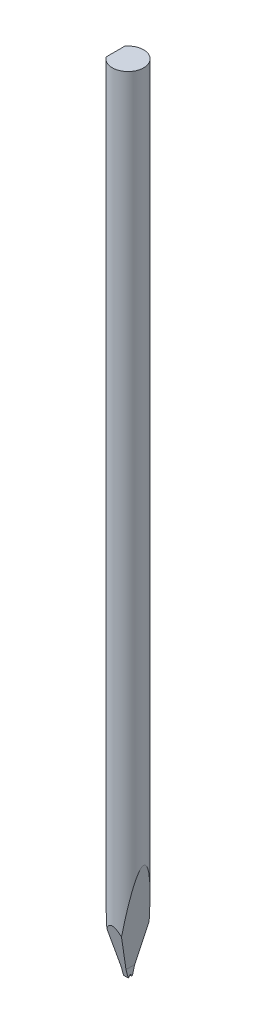
ISO-10303-21;
HEADER;
FILE_DESCRIPTION(('STEP AP214'),'2;1');
FILE_NAME('part.step','',(''),(''),'','','');
FILE_SCHEMA(('AUTOMOTIVE_DESIGN { 1 0 10303 214 1 1 1 1 }'));
ENDSEC;
DATA;
#1=APPLICATION_CONTEXT('core data for automotive mechanical design processes');
#2=APPLICATION_PROTOCOL_DEFINITION('international standard','automotive_design',2000,#1);
#3=PRODUCT_CONTEXT('',#1,'mechanical');
#4=PRODUCT('Part','Part','',(#3));
#5=PRODUCT_RELATED_PRODUCT_CATEGORY('part','',(#4));
#6=PRODUCT_DEFINITION_FORMATION('','',#4);
#7=PRODUCT_DEFINITION_CONTEXT('part definition',#1,'design');
#8=PRODUCT_DEFINITION('design','',#6,#7);
#9=PRODUCT_DEFINITION_SHAPE('','',#8);
#10=(LENGTH_UNIT() NAMED_UNIT(*) SI_UNIT(.MILLI.,.METRE.));
#11=(NAMED_UNIT(*) PLANE_ANGLE_UNIT() SI_UNIT($,.RADIAN.));
#12=(NAMED_UNIT(*) SI_UNIT($,.STERADIAN.) SOLID_ANGLE_UNIT());
#13=UNCERTAINTY_MEASURE_WITH_UNIT(LENGTH_MEASURE(1.E-05),#10,'distance_accuracy_value','');
#14=(GEOMETRIC_REPRESENTATION_CONTEXT(3) GLOBAL_UNCERTAINTY_ASSIGNED_CONTEXT((#13)) GLOBAL_UNIT_ASSIGNED_CONTEXT((#10,
#11,#12)) REPRESENTATION_CONTEXT('',''));
#15=CARTESIAN_POINT('',(0.,0.,0.));
#16=DIRECTION('',(0.,0.,1.));
#17=DIRECTION('',(1.,0.,0.));
#18=AXIS2_PLACEMENT_3D('',#15,#16,#17);
#19=CARTESIAN_POINT('',(0.,0.,0.));
#20=DIRECTION('',(0.,1.,0.));
#21=DIRECTION('',(0.,0.,1.));
#22=AXIS2_PLACEMENT_3D('',#19,#20,#21);
#23=PLANE('',#22);
#24=DIRECTION('',(0.,0.,1.));
#25=VECTOR('',#24,1.);
#26=CARTESIAN_POINT('',(0.22352,0.,0.19939));
#27=LINE('',#26,#25);
#28=CARTESIAN_POINT('',(0.22352,0.,-0.19939));
#29=VERTEX_POINT('',#28);
#30=CARTESIAN_POINT('',(0.22352,0.,-0.184500621217954));
#31=VERTEX_POINT('',#30);
#32=EDGE_CURVE('E199',#29,#31,#27,.T.);
#33=ORIENTED_EDGE('',*,*,#32,.T.);
#34=CARTESIAN_POINT('',(0.16256,0.,-0.184500621217954));
#35=DIRECTION('',(0.,1.,0.));
#36=DIRECTION('',(0.,0.,-1.));
#37=AXIS2_PLACEMENT_3D('',#34,#35,#36);
#38=ELLIPSE('',#37,0.0744184189308983,0.06096);
#39=CARTESIAN_POINT('',(0.16256,0.,-0.110082202287056));
#40=VERTEX_POINT('',#39);
#41=EDGE_CURVE('E259',#31,#40,#38,.F.);
#42=ORIENTED_EDGE('',*,*,#41,.T.);
#43=CARTESIAN_POINT('',(0.16256,0.,-0.110082202287056));
#44=DIRECTION('',(-1.,0.,0.));
#45=VECTOR('',#44,1.);
#46=LINE('',#43,#45);
#47=CARTESIAN_POINT('',(-0.1651,0.,-0.110082202287056));
#48=VERTEX_POINT('',#47);
#49=EDGE_CURVE('E299',#40,#48,#46,.T.);
#50=ORIENTED_EDGE('',*,*,#49,.T.);
#51=CARTESIAN_POINT('',(-0.1651,0.,-0.184500621217954));
#52=DIRECTION('',(0.,1.,0.));
#53=DIRECTION('',(0.,0.,1.));
#54=AXIS2_PLACEMENT_3D('',#51,#52,#53);
#55=ELLIPSE('',#54,0.0744184189308983,0.06096);
#56=CARTESIAN_POINT('',(-0.22606,0.,-0.184500621217954));
#57=VERTEX_POINT('',#56);
#58=EDGE_CURVE('E414',#48,#57,#55,.F.);
#59=ORIENTED_EDGE('',*,*,#58,.T.);
#60=DIRECTION('',(0.,0.,-1.));
#61=VECTOR('',#60,1.);
#62=CARTESIAN_POINT('',(-0.22606,0.,0.19939));
#63=LINE('',#62,#61);
#64=CARTESIAN_POINT('',(-0.22606,0.,-0.19939));
#65=VERTEX_POINT('',#64);
#66=EDGE_CURVE('E180',#57,#65,#63,.T.);
#67=ORIENTED_EDGE('',*,*,#66,.T.);
#68=DIRECTION('',(-1.,0.,0.));
#69=VECTOR('',#68,1.);
#70=CARTESIAN_POINT('',(1.50859998,0.,-0.19939));
#71=LINE('',#70,#69);
#72=EDGE_CURVE('E170',#29,#65,#71,.T.);
#73=ORIENTED_EDGE('',*,*,#72,.F.);
#74=EDGE_LOOP('',(#33,#42,#50,#59,#67,#73));
#75=FACE_BOUND('',#74,.T.);
#76=ADVANCED_FACE('F41',(#75),#23,.F.);
#77=CARTESIAN_POINT('',(0.,75.9968,0.));
#78=DIRECTION('',(0.,-1.,0.));
#79=DIRECTION('',(0.,0.,-1.));
#80=AXIS2_PLACEMENT_3D('',#77,#78,#79);
#81=CYLINDRICAL_SURFACE('',#80,1.4986);
#82=CARTESIAN_POINT('',(0.,-0.808400479442167,0.));
#83=DIRECTION('',(-0.99026806874157,-0.139173100960066,0.));
#84=DIRECTION('',(0.139173100960066,-0.99026806874157,0.));
#85=AXIS2_PLACEMENT_3D('',#82,#83,#84);
#86=ELLIPSE('',#85,10.7678853863435,1.4986);
#87=CARTESIAN_POINT('',(-0.70315911164164,4.19483657355132,1.32339307226362));
#88=VERTEX_POINT('',#87);
#89=CARTESIAN_POINT('',(-1.20142,7.74014701242463,0.89576333012688));
#90=VERTEX_POINT('',#89);
#91=EDGE_CURVE('E432',#88,#90,#86,.T.);
#92=ORIENTED_EDGE('',*,*,#91,.F.);
#93=CARTESIAN_POINT('',(0.,-0.744133610521155,0.));
#94=DIRECTION('',(0.,-0.258819045102522,0.965925826289068));
#95=DIRECTION('',(0.,-0.965925826289068,-0.258819045102522));
#96=AXIS2_PLACEMENT_3D('',#93,#94,#95);
#97=ELLIPSE('',#96,5.79014577310717,1.4986);
#98=CARTESIAN_POINT('',(0.70117191299293,4.19876995954897,1.32444701986521));
#99=VERTEX_POINT('',#98);
#100=EDGE_CURVE('E431',#99,#88,#97,.T.);
#101=ORIENTED_EDGE('',*,*,#100,.F.);
#102=CARTESIAN_POINT('',(0.,-0.790327440347405,0.));
#103=DIRECTION('',(0.990268068741571,-0.139173100960058,0.));
#104=DIRECTION('',(-0.139173100960058,-0.990268068741571,0.));
#105=AXIS2_PLACEMENT_3D('',#102,#103,#104);
#106=ELLIPSE('',#105,10.7678853863441,1.4986);
#107=CARTESIAN_POINT('',(0.70117191299293,4.19876995954897,-1.32444701986521));
#108=VERTEX_POINT('',#107);
#109=EDGE_CURVE('E369',#108,#99,#106,.T.);
#110=ORIENTED_EDGE('',*,*,#109,.F.);
#111=CARTESIAN_POINT('',(0.,-0.744133610521155,0.));
#112=DIRECTION('',(0.,-0.258819045102522,-0.965925826289068));
#113=DIRECTION('',(0.,-0.965925826289068,0.258819045102522));
#114=AXIS2_PLACEMENT_3D('',#111,#112,#113);
#115=ELLIPSE('',#114,5.79014577310717,1.4986);
#116=CARTESIAN_POINT('',(-0.70315911164164,4.19483657355132,-1.32339307226362));
#117=VERTEX_POINT('',#116);
#118=EDGE_CURVE('E429',#117,#108,#115,.T.);
#119=ORIENTED_EDGE('',*,*,#118,.F.);
#120=CARTESIAN_POINT('',(-1.20142,7.74014701242463,-0.89576333012688));
#121=VERTEX_POINT('',#120);
#122=EDGE_CURVE('E192',#121,#117,#86,.T.);
#123=ORIENTED_EDGE('',*,*,#122,.F.);
#124=DIRECTION('',(0.,-1.,0.));
#125=VECTOR('',#124,1.);
#126=CARTESIAN_POINT('',(-1.20142,75.9968,-0.89576333012688));
#127=LINE('',#126,#125);
#128=CARTESIAN_POINT('',(-1.20142,75.9968,-0.89576333012688));
#129=VERTEX_POINT('',#128);
#130=EDGE_CURVE('E354',#129,#121,#127,.T.);
#131=ORIENTED_EDGE('',*,*,#130,.F.);
#132=CARTESIAN_POINT('',(0.,75.9968,0.));
#133=DIRECTION('',(0.,1.,0.));
#134=DIRECTION('',(0.,0.,1.));
#135=AXIS2_PLACEMENT_3D('',#132,#133,#134);
#136=CIRCLE('',#135,1.4986);
#137=CARTESIAN_POINT('',(-1.20142,75.9968,0.89576333012688));
#138=VERTEX_POINT('',#137);
#139=EDGE_CURVE('E362',#138,#129,#136,.T.);
#140=ORIENTED_EDGE('',*,*,#139,.F.);
#141=DIRECTION('',(0.,-1.,0.));
#142=VECTOR('',#141,1.);
#143=CARTESIAN_POINT('',(-1.20142,75.9968,0.89576333012688));
#144=LINE('',#143,#142);
#145=EDGE_CURVE('E363',#90,#138,#144,.F.);
#146=ORIENTED_EDGE('',*,*,#145,.F.);
#147=EDGE_LOOP('',(#92,#101,#110,#119,#123,#131,#140,#146));
#148=FACE_BOUND('',#147,.T.);
#149=ADVANCED_FACE('F223',(#148),#81,.T.);
#150=CARTESIAN_POINT('',(-1.20142,75.9968,1.50859998));
#151=DIRECTION('',(-1.,0.,0.));
#152=DIRECTION('',(0.,0.,1.));
#153=AXIS2_PLACEMENT_3D('',#150,#151,#152);
#154=PLANE('',#153);
#155=ORIENTED_EDGE('',*,*,#130,.T.);
#156=DIRECTION('',(0.,0.,1.));
#157=VECTOR('',#156,1.);
#158=CARTESIAN_POINT('',(-1.20142,7.74014701242463,1.50859998));
#159=LINE('',#158,#157);
#160=EDGE_CURVE('E355',#121,#90,#159,.T.);
#161=ORIENTED_EDGE('',*,*,#160,.T.);
#162=ORIENTED_EDGE('',*,*,#145,.T.);
#163=DIRECTION('',(0.,0.,-1.));
#164=VECTOR('',#163,1.);
#165=CARTESIAN_POINT('',(-1.20142,75.9968,1.50859998));
#166=LINE('',#165,#164);
#167=EDGE_CURVE('E358',#138,#129,#166,.T.);
#168=ORIENTED_EDGE('',*,*,#167,.T.);
#169=EDGE_LOOP('',(#155,#161,#162,#168));
#170=FACE_BOUND('',#169,.T.);
#171=ADVANCED_FACE('F227',(#170),#154,.T.);
#172=CARTESIAN_POINT('',(0.,75.9968,0.));
#173=DIRECTION('',(0.,1.,0.));
#174=DIRECTION('',(0.,0.,1.));
#175=AXIS2_PLACEMENT_3D('',#172,#173,#174);
#176=PLANE('',#175);
#177=ORIENTED_EDGE('',*,*,#139,.T.);
#178=ORIENTED_EDGE('',*,*,#167,.F.);
#179=EDGE_LOOP('',(#177,#178));
#180=FACE_BOUND('',#179,.T.);
#181=ADVANCED_FACE('F221',(#180),#176,.T.);
#182=CARTESIAN_POINT('',(0.22352,0.8001,1.50859998));
#183=DIRECTION('',(0.990268068741571,-0.139173100960058,0.));
#184=DIRECTION('',(0.139173100960058,0.990268068741571,0.));
#185=AXIS2_PLACEMENT_3D('',#182,#183,#184);
#186=PLANE('',#185);
#187=ORIENTED_EDGE('',*,*,#109,.T.);
#188=DIRECTION('',(0.13451818867903,0.957146646836786,0.256466671058074));
#189=VECTOR('',#188,1.);
#190=CARTESIAN_POINT('',(0.136361723790303,0.179936640402293,0.247603877484564));
#191=LINE('',#190,#189);
#192=CARTESIAN_POINT('',(0.22352,0.8001,0.413776148864142));
#193=VERTEX_POINT('',#192);
#194=EDGE_CURVE('E400',#193,#99,#191,.T.);
#195=ORIENTED_EDGE('',*,*,#194,.F.);
#196=DIRECTION('',(0.,0.,-1.));
#197=VECTOR('',#196,1.);
#198=CARTESIAN_POINT('',(0.22352,0.8001,1.50859998));
#199=LINE('',#198,#197);
#200=CARTESIAN_POINT('',(0.22352,0.8001,-0.413776148864142));
#201=VERTEX_POINT('',#200);
#202=EDGE_CURVE('E313',#193,#201,#199,.T.);
#203=ORIENTED_EDGE('',*,*,#202,.T.);
#204=DIRECTION('',(-0.13451818867903,-0.957146646836786,0.256466671058074));
#205=VECTOR('',#204,1.);
#206=CARTESIAN_POINT('',(0.136361723790303,0.179936640402293,-0.247603877484564));
#207=LINE('',#206,#205);
#208=EDGE_CURVE('E399',#108,#201,#207,.T.);
#209=ORIENTED_EDGE('',*,*,#208,.F.);
#210=EDGE_LOOP('',(#187,#195,#203,#209));
#211=FACE_BOUND('',#210,.T.);
#212=ADVANCED_FACE('F328',(#211),#186,.T.);
#213=CARTESIAN_POINT('',(1.50859998,0.,-0.19939));
#214=DIRECTION('',(0.,-0.258819045102522,-0.965925826289068));
#215=DIRECTION('',(0.,0.965925826289068,-0.258819045102522));
#216=AXIS2_PLACEMENT_3D('',#213,#214,#215);
#217=PLANE('',#216);
#218=ORIENTED_EDGE('',*,*,#118,.T.);
#219=ORIENTED_EDGE('',*,*,#208,.T.);
#220=DIRECTION('',(0.,-0.965925826289068,0.258819045102522));
#221=VECTOR('',#220,1.);
#222=CARTESIAN_POINT('',(0.22352,0.,-0.19939));
#223=LINE('',#222,#221);
#224=EDGE_CURVE('E395',#201,#29,#223,.T.);
#225=ORIENTED_EDGE('',*,*,#224,.T.);
#226=ORIENTED_EDGE('',*,*,#72,.T.);
#227=DIRECTION('',(0.,0.965925826289068,-0.258819045102522));
#228=VECTOR('',#227,1.);
#229=CARTESIAN_POINT('',(-0.22606,0.,-0.19939));
#230=LINE('',#229,#228);
#231=CARTESIAN_POINT('',(-0.22606,0.8001,-0.413776148864142));
#232=VERTEX_POINT('',#231);
#233=EDGE_CURVE('E179',#65,#232,#230,.T.);
#234=ORIENTED_EDGE('',*,*,#233,.T.);
#235=DIRECTION('',(-0.134518188679037,0.957146646836785,-0.256466671058074));
#236=VECTOR('',#235,1.);
#237=CARTESIAN_POINT('',(-0.0842590971331311,-0.20886585086566,-0.143424563934107));
#238=LINE('',#237,#236);
#239=EDGE_CURVE('E385',#232,#117,#238,.T.);
#240=ORIENTED_EDGE('',*,*,#239,.T.);
#241=EDGE_LOOP('',(#218,#219,#225,#226,#234,#240));
#242=FACE_BOUND('',#241,.T.);
#243=ADVANCED_FACE('F331',(#242),#217,.T.);
#244=CARTESIAN_POINT('',(1.50859998,0.,0.19939));
#245=DIRECTION('',(0.,-0.258819045102522,0.965925826289068));
#246=DIRECTION('',(0.,-0.965925826289068,-0.258819045102522));
#247=AXIS2_PLACEMENT_3D('',#244,#245,#246);
#248=PLANE('',#247);
#249=ORIENTED_EDGE('',*,*,#100,.T.);
#250=DIRECTION('',(0.134518188679037,-0.957146646836785,-0.256466671058074));
#251=VECTOR('',#250,1.);
#252=CARTESIAN_POINT('',(-0.0842590971331311,-0.20886585086566,0.143424563934107));
#253=LINE('',#252,#251);
#254=CARTESIAN_POINT('',(-0.22606,0.8001,0.413776148864142));
#255=VERTEX_POINT('',#254);
#256=EDGE_CURVE('E165',#88,#255,#253,.T.);
#257=ORIENTED_EDGE('',*,*,#256,.T.);
#258=DIRECTION('',(0.,-0.965925826289068,-0.258819045102522));
#259=VECTOR('',#258,1.);
#260=CARTESIAN_POINT('',(-0.22606,0.,0.19939));
#261=LINE('',#260,#259);
#262=CARTESIAN_POINT('',(-0.22606,0.,0.19939));
#263=VERTEX_POINT('',#262);
#264=EDGE_CURVE('E157',#255,#263,#261,.T.);
#265=ORIENTED_EDGE('',*,*,#264,.T.);
#266=DIRECTION('',(-1.,0.,0.));
#267=VECTOR('',#266,1.);
#268=CARTESIAN_POINT('',(1.50859998,0.,0.19939));
#269=LINE('',#268,#267);
#270=CARTESIAN_POINT('',(0.22352,0.,0.19939));
#271=VERTEX_POINT('',#270);
#272=EDGE_CURVE('E162',#271,#263,#269,.T.);
#273=ORIENTED_EDGE('',*,*,#272,.F.);
#274=DIRECTION('',(0.,0.965925826289068,0.258819045102522));
#275=VECTOR('',#274,1.);
#276=CARTESIAN_POINT('',(0.22352,0.,0.19939));
#277=LINE('',#276,#275);
#278=EDGE_CURVE('E397',#271,#193,#277,.T.);
#279=ORIENTED_EDGE('',*,*,#278,.T.);
#280=ORIENTED_EDGE('',*,*,#194,.T.);
#281=EDGE_LOOP('',(#249,#257,#265,#273,#279,#280));
#282=FACE_BOUND('',#281,.T.);
#283=ADVANCED_FACE('F159',(#282),#248,.T.);
#284=CARTESIAN_POINT('',(-0.22606,0.8001,1.50859998));
#285=DIRECTION('',(-0.99026806874157,-0.139173100960066,0.));
#286=DIRECTION('',(0.139173100960066,-0.99026806874157,0.));
#287=AXIS2_PLACEMENT_3D('',#284,#285,#286);
#288=PLANE('',#287);
#289=ORIENTED_EDGE('',*,*,#91,.T.);
#290=ORIENTED_EDGE('',*,*,#160,.F.);
#291=ORIENTED_EDGE('',*,*,#122,.T.);
#292=ORIENTED_EDGE('',*,*,#239,.F.);
#293=DIRECTION('',(0.,0.,-1.));
#294=VECTOR('',#293,1.);
#295=CARTESIAN_POINT('',(-0.22606,0.8001,1.50859998));
#296=LINE('',#295,#294);
#297=EDGE_CURVE('E393',#255,#232,#296,.T.);
#298=ORIENTED_EDGE('',*,*,#297,.F.);
#299=ORIENTED_EDGE('',*,*,#256,.F.);
#300=EDGE_LOOP('',(#289,#290,#291,#292,#298,#299));
#301=FACE_BOUND('',#300,.T.);
#302=ADVANCED_FACE('F335',(#301),#288,.T.);
#303=CARTESIAN_POINT('',(-0.22606,0.79010002,1.50859998));
#304=DIRECTION('',(-1.,0.,0.));
#305=DIRECTION('',(0.,-1.,0.));
#306=AXIS2_PLACEMENT_3D('',#303,#304,#305);
#307=PLANE('',#306);
#308=CARTESIAN_POINT('',(-0.22606,0.0863599999999999,0.));
#309=DIRECTION('',(-1.,0.,0.));
#310=DIRECTION('',(0.,-1.,0.));
#311=AXIS2_PLACEMENT_3D('',#308,#309,#310);
#312=CIRCLE('',#311,0.1016);
#313=CARTESIAN_POINT('',(-0.22606,0.144635365933266,-0.0832258476997616));
#314=VERTEX_POINT('',#313);
#315=CARTESIAN_POINT('',(-0.22606,0.144635365933266,0.0832258476997616));
#316=VERTEX_POINT('',#315);
#317=EDGE_CURVE('E379',#314,#316,#312,.F.);
#318=ORIENTED_EDGE('',*,*,#317,.T.);
#319=DIRECTION('',(0.,0.819152044288993,-0.573576436351045));
#320=VECTOR('',#319,1.);
#321=CARTESIAN_POINT('',(-0.22606,0.0349652195599595,0.160017710906913));
#322=LINE('',#321,#320);
#323=CARTESIAN_POINT('',(-0.22606,0.,0.184500621217954));
#324=VERTEX_POINT('',#323);
#325=EDGE_CURVE('E176',#316,#324,#322,.F.);
#326=ORIENTED_EDGE('',*,*,#325,.T.);
#327=EDGE_CURVE('E173',#263,#324,#63,.T.);
#328=ORIENTED_EDGE('',*,*,#327,.F.);
#329=ORIENTED_EDGE('',*,*,#264,.F.);
#330=ORIENTED_EDGE('',*,*,#297,.T.);
#331=ORIENTED_EDGE('',*,*,#233,.F.);
#332=ORIENTED_EDGE('',*,*,#66,.F.);
#333=DIRECTION('',(0.,-0.819152044288993,-0.573576436351045));
#334=VECTOR('',#333,1.);
#335=CARTESIAN_POINT('',(-0.22606,0.144635365933266,-0.0832258476997616));
#336=LINE('',#335,#334);
#337=EDGE_CURVE('E377',#57,#314,#336,.F.);
#338=ORIENTED_EDGE('',*,*,#337,.T.);
#339=EDGE_LOOP('',(#318,#326,#328,#329,#330,#331,#332,#338));
#340=FACE_BOUND('',#339,.T.);
#341=ADVANCED_FACE('F174',(#340),#307,.T.);
#342=CARTESIAN_POINT('',(0.22352,-0.00999998,1.50859998));
#343=DIRECTION('',(1.,0.,0.));
#344=DIRECTION('',(0.,1.,0.));
#345=AXIS2_PLACEMENT_3D('',#342,#343,#344);
#346=PLANE('',#345);
#347=CARTESIAN_POINT('',(0.22352,0.0863599999999999,0.));
#348=DIRECTION('',(1.,0.,0.));
#349=DIRECTION('',(0.,1.,0.));
#350=AXIS2_PLACEMENT_3D('',#347,#348,#349);
#351=CIRCLE('',#350,0.1016);
#352=CARTESIAN_POINT('',(0.22352,0.144635365933266,0.0832258476997616));
#353=VERTEX_POINT('',#352);
#354=CARTESIAN_POINT('',(0.22352,0.144635365933266,-0.0832258476997616));
#355=VERTEX_POINT('',#354);
#356=EDGE_CURVE('E425',#353,#355,#351,.F.);
#357=ORIENTED_EDGE('',*,*,#356,.T.);
#358=DIRECTION('',(0.,0.819152044288993,0.573576436351045));
#359=VECTOR('',#358,1.);
#360=CARTESIAN_POINT('',(0.22352,0.0349652195599597,-0.160017710906913));
#361=LINE('',#360,#359);
#362=EDGE_CURVE('E266',#355,#31,#361,.F.);
#363=ORIENTED_EDGE('',*,*,#362,.T.);
#364=ORIENTED_EDGE('',*,*,#32,.F.);
#365=ORIENTED_EDGE('',*,*,#224,.F.);
#366=ORIENTED_EDGE('',*,*,#202,.F.);
#367=ORIENTED_EDGE('',*,*,#278,.F.);
#368=CARTESIAN_POINT('',(0.22352,0.,0.184500621217954));
#369=VERTEX_POINT('',#368);
#370=EDGE_CURVE('E169',#369,#271,#27,.T.);
#371=ORIENTED_EDGE('',*,*,#370,.F.);
#372=DIRECTION('',(0.,-0.819152044288993,0.573576436351045));
#373=VECTOR('',#372,1.);
#374=CARTESIAN_POINT('',(0.22352,0.144635365933266,0.0832258476997616));
#375=LINE('',#374,#373);
#376=EDGE_CURVE('E272',#369,#353,#375,.F.);
#377=ORIENTED_EDGE('',*,*,#376,.T.);
#378=EDGE_LOOP('',(#357,#363,#364,#365,#366,#367,#371,#377));
#379=FACE_BOUND('',#378,.T.);
#380=ADVANCED_FACE('F220',(#379),#346,.T.);
#381=CARTESIAN_POINT('',(-0.1651,0.,0.110082202287056));
#382=DIRECTION('',(1.,0.,0.));
#383=VECTOR('',#382,1.);
#384=LINE('',#381,#383);
#385=CARTESIAN_POINT('',(-0.1651,0.,0.110082202287056));
#386=VERTEX_POINT('',#385);
#387=CARTESIAN_POINT('',(0.16256,0.,0.110082202287056));
#388=VERTEX_POINT('',#387);
#389=EDGE_CURVE('E370',#386,#388,#384,.T.);
#390=ORIENTED_EDGE('',*,*,#389,.T.);
#391=CARTESIAN_POINT('',(0.16256,0.,0.184500621217954));
#392=DIRECTION('',(0.,1.,0.));
#393=DIRECTION('',(0.,0.,-1.));
#394=AXIS2_PLACEMENT_3D('',#391,#392,#393);
#395=ELLIPSE('',#394,0.0744184189308983,0.06096);
#396=EDGE_CURVE('E50',#388,#369,#395,.F.);
#397=ORIENTED_EDGE('',*,*,#396,.T.);
#398=ORIENTED_EDGE('',*,*,#370,.T.);
#399=ORIENTED_EDGE('',*,*,#272,.T.);
#400=ORIENTED_EDGE('',*,*,#327,.T.);
#401=CARTESIAN_POINT('',(-0.1651,0.,0.184500621217954));
#402=DIRECTION('',(0.,1.,0.));
#403=DIRECTION('',(0.,0.,1.));
#404=AXIS2_PLACEMENT_3D('',#401,#402,#403);
#405=ELLIPSE('',#404,0.0744184189308983,0.06096);
#406=EDGE_CURVE('E416',#324,#386,#405,.F.);
#407=ORIENTED_EDGE('',*,*,#406,.T.);
#408=EDGE_LOOP('',(#390,#397,#398,#399,#400,#407));
#409=FACE_BOUND('',#408,.T.);
#410=ADVANCED_FACE('F182',(#409),#23,.F.);
#411=CARTESIAN_POINT('',(-1.20142,0.109670146373306,-0.0332903390799046));
#412=DIRECTION('',(0.,0.573576436351045,-0.819152044288992));
#413=DIRECTION('',(0.,0.819152044288993,0.573576436351045));
#414=AXIS2_PLACEMENT_3D('',#411,#412,#413);
#415=PLANE('',#414);
#416=ORIENTED_EDGE('',*,*,#49,.F.);
#417=DIRECTION('',(0.,0.819152044288993,0.573576436351045));
#418=VECTOR('',#417,1.);
#419=CARTESIAN_POINT('',(0.16256,0.109670146373306,-0.0332903390799046));
#420=LINE('',#419,#418);
#421=CARTESIAN_POINT('',(0.16256,0.109670146373306,-0.0332903390799046));
#422=VERTEX_POINT('',#421);
#423=EDGE_CURVE('E269',#40,#422,#420,.T.);
#424=ORIENTED_EDGE('',*,*,#423,.T.);
#425=DIRECTION('',(1.,0.,0.));
#426=VECTOR('',#425,1.);
#427=CARTESIAN_POINT('',(-1.20142,0.109670146373306,-0.0332903390799046));
#428=LINE('',#427,#426);
#429=CARTESIAN_POINT('',(-0.1651,0.109670146373306,-0.0332903390799046));
#430=VERTEX_POINT('',#429);
#431=EDGE_CURVE('E292',#430,#422,#428,.T.);
#432=ORIENTED_EDGE('',*,*,#431,.F.);
#433=DIRECTION('',(0.,-0.819152044288993,-0.573576436351045));
#434=VECTOR('',#433,1.);
#435=CARTESIAN_POINT('',(-0.1651,0.,-0.110082202287056));
#436=LINE('',#435,#434);
#437=EDGE_CURVE('E409',#430,#48,#436,.T.);
#438=ORIENTED_EDGE('',*,*,#437,.T.);
#439=EDGE_LOOP('',(#416,#424,#432,#438));
#440=FACE_BOUND('',#439,.T.);
#441=ADVANCED_FACE('F219',(#440),#415,.F.);
#442=CARTESIAN_POINT('',(-1.20142,-0.00999998000000012,0.117084263665002));
#443=DIRECTION('',(0.,0.573576436351045,0.819152044288993));
#444=DIRECTION('',(0.,-0.819152044288993,0.573576436351045));
#445=AXIS2_PLACEMENT_3D('',#442,#443,#444);
#446=PLANE('',#445);
#447=DIRECTION('',(1.,0.,0.));
#448=VECTOR('',#447,1.);
#449=CARTESIAN_POINT('',(-1.20142,0.109670146373306,0.0332903390799046));
#450=LINE('',#449,#448);
#451=CARTESIAN_POINT('',(-0.1651,0.109670146373306,0.0332903390799046));
#452=VERTEX_POINT('',#451);
#453=CARTESIAN_POINT('',(0.16256,0.109670146373306,0.0332903390799046));
#454=VERTEX_POINT('',#453);
#455=EDGE_CURVE('E403',#452,#454,#450,.T.);
#456=ORIENTED_EDGE('',*,*,#455,.T.);
#457=DIRECTION('',(0.,-0.819152044288993,0.573576436351045));
#458=VECTOR('',#457,1.);
#459=CARTESIAN_POINT('',(0.16256,0.,0.110082202287056));
#460=LINE('',#459,#458);
#461=EDGE_CURVE('E63',#454,#388,#460,.T.);
#462=ORIENTED_EDGE('',*,*,#461,.T.);
#463=ORIENTED_EDGE('',*,*,#389,.F.);
#464=DIRECTION('',(0.,0.819152044288993,-0.573576436351045));
#465=VECTOR('',#464,1.);
#466=CARTESIAN_POINT('',(-0.1651,0.109670146373306,0.0332903390799047));
#467=LINE('',#466,#465);
#468=EDGE_CURVE('E375',#386,#452,#467,.T.);
#469=ORIENTED_EDGE('',*,*,#468,.T.);
#470=EDGE_LOOP('',(#456,#462,#463,#469));
#471=FACE_BOUND('',#470,.T.);
#472=ADVANCED_FACE('F323',(#471),#446,.F.);
#473=CARTESIAN_POINT('',(-1.20142,0.0863599999999999,0.));
#474=DIRECTION('',(1.,0.,0.));
#475=DIRECTION('',(0.,0.,-1.));
#476=AXIS2_PLACEMENT_3D('',#473,#474,#475);
#477=CYLINDRICAL_SURFACE('',#476,0.0406399999999999);
#478=ORIENTED_EDGE('',*,*,#431,.T.);
#479=CARTESIAN_POINT('',(0.16256,0.0863599999999999,0.));
#480=DIRECTION('',(1.,0.,0.));
#481=DIRECTION('',(0.,1.,0.));
#482=AXIS2_PLACEMENT_3D('',#479,#480,#481);
#483=CIRCLE('',#482,0.0406399999999999);
#484=EDGE_CURVE('E11',#422,#454,#483,.T.);
#485=ORIENTED_EDGE('',*,*,#484,.T.);
#486=ORIENTED_EDGE('',*,*,#455,.F.);
#487=CARTESIAN_POINT('',(-0.1651,0.0863599999999999,0.));
#488=DIRECTION('',(-1.,0.,0.));
#489=DIRECTION('',(0.,-1.,0.));
#490=AXIS2_PLACEMENT_3D('',#487,#488,#489);
#491=CIRCLE('',#490,0.0406399999999999);
#492=EDGE_CURVE('E407',#452,#430,#491,.T.);
#493=ORIENTED_EDGE('',*,*,#492,.T.);
#494=EDGE_LOOP('',(#478,#485,#486,#493));
#495=FACE_BOUND('',#494,.T.);
#496=ADVANCED_FACE('F240',(#495),#477,.F.);
#497=CARTESIAN_POINT('',(-0.1651,0.144635365933266,-0.0832258476997615));
#498=DIRECTION('',(0.,0.819152044288993,0.573576436351045));
#499=DIRECTION('',(0.,-0.573576436351045,0.819152044288992));
#500=AXIS2_PLACEMENT_3D('',#497,#498,#499);
#501=CYLINDRICAL_SURFACE('',#500,0.06096);
#502=ORIENTED_EDGE('',*,*,#58,.F.);
#503=ORIENTED_EDGE('',*,*,#437,.F.);
#504=CARTESIAN_POINT('',(-0.1651,0.144635365933266,-0.0832258476997616));
#505=DIRECTION('',(0.,0.819152044288993,0.573576436351044));
#506=DIRECTION('',(0.,-0.573576436351044,0.819152044288993));
#507=AXIS2_PLACEMENT_3D('',#504,#505,#506);
#508=CIRCLE('',#507,0.06096);
#509=EDGE_CURVE('E286',#314,#430,#508,.T.);
#510=ORIENTED_EDGE('',*,*,#509,.F.);
#511=ORIENTED_EDGE('',*,*,#337,.F.);
#512=EDGE_LOOP('',(#502,#503,#510,#511));
#513=FACE_BOUND('',#512,.T.);
#514=ADVANCED_FACE('F236',(#513),#501,.T.);
#515=CARTESIAN_POINT('',(-0.1651,0.0863599999999999,0.));
#516=DIRECTION('',(-1.,0.,0.));
#517=DIRECTION('',(0.,-1.,0.));
#518=AXIS2_PLACEMENT_3D('',#515,#516,#517);
#519=TOROIDAL_SURFACE('',#518,0.1016,0.06096);
#520=ORIENTED_EDGE('',*,*,#509,.T.);
#521=ORIENTED_EDGE('',*,*,#492,.F.);
#522=CARTESIAN_POINT('',(-0.1651,0.144635365933266,0.0832258476997616));
#523=DIRECTION('',(0.,-0.819152044288993,0.573576436351045));
#524=DIRECTION('',(0.,-0.573576436351045,-0.819152044288993));
#525=AXIS2_PLACEMENT_3D('',#522,#523,#524);
#526=CIRCLE('',#525,0.06096);
#527=EDGE_CURVE('E283',#316,#452,#526,.T.);
#528=ORIENTED_EDGE('',*,*,#527,.F.);
#529=ORIENTED_EDGE('',*,*,#317,.F.);
#530=EDGE_LOOP('',(#520,#521,#528,#529));
#531=FACE_BOUND('',#530,.T.);
#532=ADVANCED_FACE('F232',(#531),#519,.T.);
#533=CARTESIAN_POINT('',(-0.1651,0.0249652395599597,0.167019772284859));
#534=DIRECTION('',(0.,-0.819152044288993,0.573576436351045));
#535=DIRECTION('',(0.,-0.573576436351045,-0.819152044288993));
#536=AXIS2_PLACEMENT_3D('',#533,#534,#535);
#537=CYLINDRICAL_SURFACE('',#536,0.06096);
#538=ORIENTED_EDGE('',*,*,#406,.F.);
#539=ORIENTED_EDGE('',*,*,#325,.F.);
#540=ORIENTED_EDGE('',*,*,#527,.T.);
#541=ORIENTED_EDGE('',*,*,#468,.F.);
#542=EDGE_LOOP('',(#538,#539,#540,#541));
#543=FACE_BOUND('',#542,.T.);
#544=ADVANCED_FACE('F229',(#543),#537,.T.);
#545=CARTESIAN_POINT('',(0.16256,0.0249652395599596,0.167019772284859));
#546=DIRECTION('',(0.,0.819152044288993,-0.573576436351045));
#547=DIRECTION('',(0.,0.573576436351045,0.819152044288993));
#548=AXIS2_PLACEMENT_3D('',#545,#546,#547);
#549=CYLINDRICAL_SURFACE('',#548,0.06096);
#550=ORIENTED_EDGE('',*,*,#396,.F.);
#551=ORIENTED_EDGE('',*,*,#461,.F.);
#552=CARTESIAN_POINT('',(0.16256,0.144635365933266,0.0832258476997616));
#553=DIRECTION('',(0.,0.819152044288993,-0.573576436351045));
#554=DIRECTION('',(0.,0.573576436351045,0.819152044288993));
#555=AXIS2_PLACEMENT_3D('',#552,#553,#554);
#556=CIRCLE('',#555,0.06096);
#557=EDGE_CURVE('E45',#353,#454,#556,.T.);
#558=ORIENTED_EDGE('',*,*,#557,.F.);
#559=ORIENTED_EDGE('',*,*,#376,.F.);
#560=EDGE_LOOP('',(#550,#551,#558,#559));
#561=FACE_BOUND('',#560,.T.);
#562=ADVANCED_FACE('F43',(#561),#549,.T.);
#563=CARTESIAN_POINT('',(0.16256,0.0863599999999999,0.));
#564=DIRECTION('',(1.,0.,0.));
#565=DIRECTION('',(0.,1.,0.));
#566=AXIS2_PLACEMENT_3D('',#563,#564,#565);
#567=TOROIDAL_SURFACE('',#566,0.1016,0.06096);
#568=ORIENTED_EDGE('',*,*,#557,.T.);
#569=ORIENTED_EDGE('',*,*,#484,.F.);
#570=CARTESIAN_POINT('',(0.16256,0.144635365933266,-0.0832258476997616));
#571=DIRECTION('',(0.,-0.819152044288993,-0.573576436351045));
#572=DIRECTION('',(0.,0.573576436351045,-0.819152044288993));
#573=AXIS2_PLACEMENT_3D('',#570,#571,#572);
#574=CIRCLE('',#573,0.06096);
#575=EDGE_CURVE('E282',#355,#422,#574,.T.);
#576=ORIENTED_EDGE('',*,*,#575,.F.);
#577=ORIENTED_EDGE('',*,*,#356,.F.);
#578=EDGE_LOOP('',(#568,#569,#576,#577));
#579=FACE_BOUND('',#578,.T.);
#580=ADVANCED_FACE('F244',(#579),#567,.T.);
#581=CARTESIAN_POINT('',(0.16256,0.144635365933266,-0.0832258476997616));
#582=DIRECTION('',(0.,-0.819152044288993,-0.573576436351045));
#583=DIRECTION('',(0.,0.573576436351045,-0.819152044288992));
#584=AXIS2_PLACEMENT_3D('',#581,#582,#583);
#585=CYLINDRICAL_SURFACE('',#584,0.06096);
#586=ORIENTED_EDGE('',*,*,#41,.F.);
#587=ORIENTED_EDGE('',*,*,#362,.F.);
#588=ORIENTED_EDGE('',*,*,#575,.T.);
#589=ORIENTED_EDGE('',*,*,#423,.F.);
#590=EDGE_LOOP('',(#586,#587,#588,#589));
#591=FACE_BOUND('',#590,.T.);
#592=ADVANCED_FACE('F242',(#591),#585,.T.);
#593=CLOSED_SHELL('',(#76,#149,#171,#181,#212,#243,#283,#302,#341,#380,#410,#441,#472,#496,#514,
#532,#544,#562,#580,#592));
#594=MANIFOLD_SOLID_BREP('B2',#593);
#595=ADVANCED_BREP_SHAPE_REPRESENTATION('',(#18,#594),#14);
#596=SHAPE_DEFINITION_REPRESENTATION(#9,#595);
ENDSEC;
END-ISO-10303-21;
